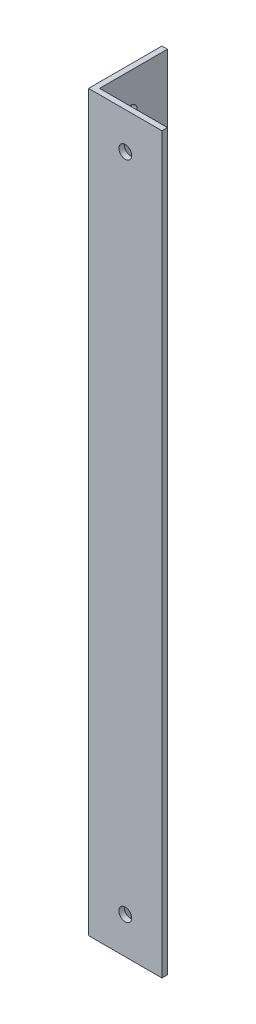
ISO-10303-21;
HEADER;
FILE_DESCRIPTION(('STEP AP214'),'2;1');
FILE_NAME('part.step','',(''),(''),'','','');
FILE_SCHEMA(('AUTOMOTIVE_DESIGN { 1 0 10303 214 1 1 1 1 }'));
ENDSEC;
DATA;
#1=APPLICATION_CONTEXT('core data for automotive mechanical design processes');
#2=APPLICATION_PROTOCOL_DEFINITION('international standard','automotive_design',2000,#1);
#3=PRODUCT_CONTEXT('',#1,'mechanical');
#4=PRODUCT('Part','Part','',(#3));
#5=PRODUCT_RELATED_PRODUCT_CATEGORY('part','',(#4));
#6=PRODUCT_DEFINITION_FORMATION('','',#4);
#7=PRODUCT_DEFINITION_CONTEXT('part definition',#1,'design');
#8=PRODUCT_DEFINITION('design','',#6,#7);
#9=PRODUCT_DEFINITION_SHAPE('','',#8);
#10=(LENGTH_UNIT() NAMED_UNIT(*) SI_UNIT(.MILLI.,.METRE.));
#11=(NAMED_UNIT(*) PLANE_ANGLE_UNIT() SI_UNIT($,.RADIAN.));
#12=(NAMED_UNIT(*) SI_UNIT($,.STERADIAN.) SOLID_ANGLE_UNIT());
#13=UNCERTAINTY_MEASURE_WITH_UNIT(LENGTH_MEASURE(1.E-05),#10,'distance_accuracy_value','');
#14=(GEOMETRIC_REPRESENTATION_CONTEXT(3) GLOBAL_UNCERTAINTY_ASSIGNED_CONTEXT((#13)) GLOBAL_UNIT_ASSIGNED_CONTEXT((#10,
#11,#12)) REPRESENTATION_CONTEXT('',''));
#15=CARTESIAN_POINT('',(0.,0.,0.));
#16=DIRECTION('',(0.,0.,1.));
#17=DIRECTION('',(1.,0.,0.));
#18=AXIS2_PLACEMENT_3D('',#15,#16,#17);
#19=CARTESIAN_POINT('',(0.,200.,-20.));
#20=DIRECTION('',(1.,0.,0.));
#21=DIRECTION('',(0.,0.,-1.));
#22=AXIS2_PLACEMENT_3D('',#19,#20,#21);
#23=PLANE('',#22);
#24=CARTESIAN_POINT('',(0.,10.,-10.));
#25=DIRECTION('',(-1.,0.,0.));
#26=DIRECTION('',(0.,0.,-1.));
#27=AXIS2_PLACEMENT_3D('',#24,#25,#26);
#28=CIRCLE('',#27,1.75);
#29=CARTESIAN_POINT('',(0.,10.,-11.75));
#30=VERTEX_POINT('',#29);
#31=EDGE_CURVE('E164',#30,#30,#28,.T.);
#32=ORIENTED_EDGE('',*,*,#31,.F.);
#33=EDGE_LOOP('',(#32));
#34=FACE_BOUND('',#33,.T.);
#35=CARTESIAN_POINT('',(0.,190.,-10.));
#36=DIRECTION('',(1.,0.,0.));
#37=DIRECTION('',(0.,0.,-1.));
#38=AXIS2_PLACEMENT_3D('',#35,#36,#37);
#39=CIRCLE('',#38,1.75);
#40=CARTESIAN_POINT('',(0.,190.,-11.75));
#41=VERTEX_POINT('',#40);
#42=EDGE_CURVE('E167',#41,#41,#39,.T.);
#43=ORIENTED_EDGE('',*,*,#42,.T.);
#44=EDGE_LOOP('',(#43));
#45=FACE_BOUND('',#44,.T.);
#46=DIRECTION('',(0.,0.,1.));
#47=VECTOR('',#46,1.);
#48=CARTESIAN_POINT('',(0.,0.,-20.));
#49=LINE('',#48,#47);
#50=CARTESIAN_POINT('',(0.,0.,-20.));
#51=VERTEX_POINT('',#50);
#52=CARTESIAN_POINT('',(0.,0.,0.));
#53=VERTEX_POINT('',#52);
#54=EDGE_CURVE('E119',#51,#53,#49,.T.);
#55=ORIENTED_EDGE('',*,*,#54,.T.);
#56=DIRECTION('',(0.,-1.,0.));
#57=VECTOR('',#56,1.);
#58=CARTESIAN_POINT('',(0.,200.,0.));
#59=LINE('',#58,#57);
#60=CARTESIAN_POINT('',(0.,200.,0.));
#61=VERTEX_POINT('',#60);
#62=EDGE_CURVE('E11',#61,#53,#59,.T.);
#63=ORIENTED_EDGE('',*,*,#62,.F.);
#64=DIRECTION('',(0.,0.,1.));
#65=VECTOR('',#64,1.);
#66=CARTESIAN_POINT('',(0.,200.,-20.));
#67=LINE('',#66,#65);
#68=CARTESIAN_POINT('',(0.,200.,-20.));
#69=VERTEX_POINT('',#68);
#70=EDGE_CURVE('E130',#69,#61,#67,.T.);
#71=ORIENTED_EDGE('',*,*,#70,.F.);
#72=DIRECTION('',(0.,-1.,0.));
#73=VECTOR('',#72,1.);
#74=CARTESIAN_POINT('',(0.,200.,-20.));
#75=LINE('',#74,#73);
#76=EDGE_CURVE('E115',#69,#51,#75,.T.);
#77=ORIENTED_EDGE('',*,*,#76,.T.);
#78=EDGE_LOOP('',(#55,#63,#71,#77));
#79=FACE_BOUND('',#78,.T.);
#80=ADVANCED_FACE('F35',(#34,#45,#79),#23,.F.);
#81=CARTESIAN_POINT('',(0.,200.,0.));
#82=DIRECTION('',(0.,0.,-1.));
#83=DIRECTION('',(-1.,0.,0.));
#84=AXIS2_PLACEMENT_3D('',#81,#82,#83);
#85=PLANE('',#84);
#86=CARTESIAN_POINT('',(10.,10.,0.));
#87=DIRECTION('',(0.,0.,-1.));
#88=DIRECTION('',(1.,0.,0.));
#89=AXIS2_PLACEMENT_3D('',#86,#87,#88);
#90=CIRCLE('',#89,1.75);
#91=CARTESIAN_POINT('',(11.75,10.,0.));
#92=VERTEX_POINT('',#91);
#93=EDGE_CURVE('E198',#92,#92,#90,.T.);
#94=ORIENTED_EDGE('',*,*,#93,.T.);
#95=EDGE_LOOP('',(#94));
#96=FACE_BOUND('',#95,.T.);
#97=CARTESIAN_POINT('',(10.,190.,0.));
#98=DIRECTION('',(0.,0.,1.));
#99=DIRECTION('',(1.,0.,0.));
#100=AXIS2_PLACEMENT_3D('',#97,#98,#99);
#101=CIRCLE('',#100,1.75);
#102=CARTESIAN_POINT('',(11.75,190.,0.));
#103=VERTEX_POINT('',#102);
#104=EDGE_CURVE('E169',#103,#103,#101,.T.);
#105=ORIENTED_EDGE('',*,*,#104,.F.);
#106=EDGE_LOOP('',(#105));
#107=FACE_BOUND('',#106,.T.);
#108=DIRECTION('',(1.,0.,0.));
#109=VECTOR('',#108,1.);
#110=CARTESIAN_POINT('',(0.,0.,0.));
#111=LINE('',#110,#109);
#112=CARTESIAN_POINT('',(20.,0.,0.));
#113=VERTEX_POINT('',#112);
#114=EDGE_CURVE('E122',#53,#113,#111,.T.);
#115=ORIENTED_EDGE('',*,*,#114,.T.);
#116=DIRECTION('',(0.,-1.,0.));
#117=VECTOR('',#116,1.);
#118=CARTESIAN_POINT('',(20.,200.,0.));
#119=LINE('',#118,#117);
#120=CARTESIAN_POINT('',(20.,200.,0.));
#121=VERTEX_POINT('',#120);
#122=EDGE_CURVE('E43',#121,#113,#119,.T.);
#123=ORIENTED_EDGE('',*,*,#122,.F.);
#124=DIRECTION('',(1.,0.,0.));
#125=VECTOR('',#124,1.);
#126=CARTESIAN_POINT('',(0.,200.,0.));
#127=LINE('',#126,#125);
#128=EDGE_CURVE('E88',#61,#121,#127,.T.);
#129=ORIENTED_EDGE('',*,*,#128,.F.);
#130=ORIENTED_EDGE('',*,*,#62,.T.);
#131=EDGE_LOOP('',(#115,#123,#129,#130));
#132=FACE_BOUND('',#131,.T.);
#133=ADVANCED_FACE('F155',(#96,#107,#132),#85,.F.);
#134=CARTESIAN_POINT('',(20.,200.,0.));
#135=DIRECTION('',(-1.,0.,0.));
#136=DIRECTION('',(0.,0.,1.));
#137=AXIS2_PLACEMENT_3D('',#134,#135,#136);
#138=PLANE('',#137);
#139=DIRECTION('',(0.,0.,-1.));
#140=VECTOR('',#139,1.);
#141=CARTESIAN_POINT('',(20.,0.,0.));
#142=LINE('',#141,#140);
#143=CARTESIAN_POINT('',(20.,0.,-1.5));
#144=VERTEX_POINT('',#143);
#145=EDGE_CURVE('E125',#113,#144,#142,.T.);
#146=ORIENTED_EDGE('',*,*,#145,.T.);
#147=DIRECTION('',(0.,-1.,0.));
#148=VECTOR('',#147,1.);
#149=CARTESIAN_POINT('',(20.,200.,-1.5));
#150=LINE('',#149,#148);
#151=CARTESIAN_POINT('',(20.,200.,-1.5));
#152=VERTEX_POINT('',#151);
#153=EDGE_CURVE('E110',#152,#144,#150,.T.);
#154=ORIENTED_EDGE('',*,*,#153,.F.);
#155=DIRECTION('',(0.,0.,-1.));
#156=VECTOR('',#155,1.);
#157=CARTESIAN_POINT('',(20.,200.,0.));
#158=LINE('',#157,#156);
#159=EDGE_CURVE('E101',#121,#152,#158,.T.);
#160=ORIENTED_EDGE('',*,*,#159,.F.);
#161=ORIENTED_EDGE('',*,*,#122,.T.);
#162=EDGE_LOOP('',(#146,#154,#160,#161));
#163=FACE_BOUND('',#162,.T.);
#164=ADVANCED_FACE('F136',(#163),#138,.F.);
#165=CARTESIAN_POINT('',(20.,200.,-1.5));
#166=DIRECTION('',(0.,0.,1.));
#167=DIRECTION('',(1.,0.,0.));
#168=AXIS2_PLACEMENT_3D('',#165,#166,#167);
#169=PLANE('',#168);
#170=CARTESIAN_POINT('',(10.,10.,-1.5));
#171=DIRECTION('',(0.,0.,1.));
#172=DIRECTION('',(1.,0.,0.));
#173=AXIS2_PLACEMENT_3D('',#170,#171,#172);
#174=CIRCLE('',#173,1.75);
#175=CARTESIAN_POINT('',(11.75,10.,-1.5));
#176=VERTEX_POINT('',#175);
#177=EDGE_CURVE('E196',#176,#176,#174,.T.);
#178=ORIENTED_EDGE('',*,*,#177,.T.);
#179=EDGE_LOOP('',(#178));
#180=FACE_BOUND('',#179,.T.);
#181=CARTESIAN_POINT('',(10.,190.,-1.5));
#182=DIRECTION('',(0.,0.,1.));
#183=DIRECTION('',(1.,0.,0.));
#184=AXIS2_PLACEMENT_3D('',#181,#182,#183);
#185=CIRCLE('',#184,1.75);
#186=CARTESIAN_POINT('',(11.75,190.,-1.5));
#187=VERTEX_POINT('',#186);
#188=EDGE_CURVE('E123',#187,#187,#185,.F.);
#189=ORIENTED_EDGE('',*,*,#188,.F.);
#190=EDGE_LOOP('',(#189));
#191=FACE_BOUND('',#190,.T.);
#192=DIRECTION('',(-1.,0.,0.));
#193=VECTOR('',#192,1.);
#194=CARTESIAN_POINT('',(20.,0.,-1.5));
#195=LINE('',#194,#193);
#196=CARTESIAN_POINT('',(1.5,0.,-1.5));
#197=VERTEX_POINT('',#196);
#198=EDGE_CURVE('E109',#144,#197,#195,.T.);
#199=ORIENTED_EDGE('',*,*,#198,.T.);
#200=DIRECTION('',(0.,-1.,0.));
#201=VECTOR('',#200,1.);
#202=CARTESIAN_POINT('',(1.5,200.,-1.5));
#203=LINE('',#202,#201);
#204=CARTESIAN_POINT('',(1.5,200.,-1.5));
#205=VERTEX_POINT('',#204);
#206=EDGE_CURVE('E106',#205,#197,#203,.T.);
#207=ORIENTED_EDGE('',*,*,#206,.F.);
#208=DIRECTION('',(-1.,0.,0.));
#209=VECTOR('',#208,1.);
#210=CARTESIAN_POINT('',(20.,200.,-1.5));
#211=LINE('',#210,#209);
#212=EDGE_CURVE('E95',#152,#205,#211,.T.);
#213=ORIENTED_EDGE('',*,*,#212,.F.);
#214=ORIENTED_EDGE('',*,*,#153,.T.);
#215=EDGE_LOOP('',(#199,#207,#213,#214));
#216=FACE_BOUND('',#215,.T.);
#217=ADVANCED_FACE('F107',(#180,#191,#216),#169,.F.);
#218=CARTESIAN_POINT('',(1.5,200.,-1.5));
#219=DIRECTION('',(-1.,0.,0.));
#220=DIRECTION('',(0.,0.,1.));
#221=AXIS2_PLACEMENT_3D('',#218,#219,#220);
#222=PLANE('',#221);
#223=CARTESIAN_POINT('',(1.5,10.,-10.));
#224=DIRECTION('',(-1.,0.,0.));
#225=DIRECTION('',(0.,0.,1.));
#226=AXIS2_PLACEMENT_3D('',#223,#224,#225);
#227=CIRCLE('',#226,1.75);
#228=CARTESIAN_POINT('',(1.5,10.,-8.25));
#229=VERTEX_POINT('',#228);
#230=EDGE_CURVE('E175',#229,#229,#227,.F.);
#231=ORIENTED_EDGE('',*,*,#230,.F.);
#232=EDGE_LOOP('',(#231));
#233=FACE_BOUND('',#232,.T.);
#234=CARTESIAN_POINT('',(1.5,190.,-10.));
#235=DIRECTION('',(-1.,0.,0.));
#236=DIRECTION('',(0.,0.,1.));
#237=AXIS2_PLACEMENT_3D('',#234,#235,#236);
#238=CIRCLE('',#237,1.75);
#239=CARTESIAN_POINT('',(1.5,190.,-8.25));
#240=VERTEX_POINT('',#239);
#241=EDGE_CURVE('E170',#240,#240,#238,.T.);
#242=ORIENTED_EDGE('',*,*,#241,.T.);
#243=EDGE_LOOP('',(#242));
#244=FACE_BOUND('',#243,.T.);
#245=DIRECTION('',(0.,0.,-1.));
#246=VECTOR('',#245,1.);
#247=CARTESIAN_POINT('',(1.5,0.,-1.5));
#248=LINE('',#247,#246);
#249=CARTESIAN_POINT('',(1.5,0.,-20.));
#250=VERTEX_POINT('',#249);
#251=EDGE_CURVE('E74',#197,#250,#248,.T.);
#252=ORIENTED_EDGE('',*,*,#251,.T.);
#253=DIRECTION('',(0.,-1.,0.));
#254=VECTOR('',#253,1.);
#255=CARTESIAN_POINT('',(1.5,200.,-20.));
#256=LINE('',#255,#254);
#257=CARTESIAN_POINT('',(1.5,200.,-20.));
#258=VERTEX_POINT('',#257);
#259=EDGE_CURVE('E111',#258,#250,#256,.T.);
#260=ORIENTED_EDGE('',*,*,#259,.F.);
#261=DIRECTION('',(0.,0.,-1.));
#262=VECTOR('',#261,1.);
#263=CARTESIAN_POINT('',(1.5,200.,-1.5));
#264=LINE('',#263,#262);
#265=EDGE_CURVE('E99',#205,#258,#264,.T.);
#266=ORIENTED_EDGE('',*,*,#265,.F.);
#267=ORIENTED_EDGE('',*,*,#206,.T.);
#268=EDGE_LOOP('',(#252,#260,#266,#267));
#269=FACE_BOUND('',#268,.T.);
#270=ADVANCED_FACE('F113',(#233,#244,#269),#222,.F.);
#271=CARTESIAN_POINT('',(1.5,200.,-20.));
#272=DIRECTION('',(0.,0.,1.));
#273=DIRECTION('',(1.,0.,0.));
#274=AXIS2_PLACEMENT_3D('',#271,#272,#273);
#275=PLANE('',#274);
#276=DIRECTION('',(-1.,0.,0.));
#277=VECTOR('',#276,1.);
#278=CARTESIAN_POINT('',(1.5,0.,-20.));
#279=LINE('',#278,#277);
#280=EDGE_CURVE('E80',#250,#51,#279,.T.);
#281=ORIENTED_EDGE('',*,*,#280,.T.);
#282=ORIENTED_EDGE('',*,*,#76,.F.);
#283=DIRECTION('',(-1.,0.,0.));
#284=VECTOR('',#283,1.);
#285=CARTESIAN_POINT('',(1.5,200.,-20.));
#286=LINE('',#285,#284);
#287=EDGE_CURVE('E51',#258,#69,#286,.T.);
#288=ORIENTED_EDGE('',*,*,#287,.F.);
#289=ORIENTED_EDGE('',*,*,#259,.T.);
#290=EDGE_LOOP('',(#281,#282,#288,#289));
#291=FACE_BOUND('',#290,.T.);
#292=ADVANCED_FACE('F143',(#291),#275,.F.);
#293=CARTESIAN_POINT('',(0.,200.,0.));
#294=DIRECTION('',(0.,1.,0.));
#295=DIRECTION('',(0.,0.,1.));
#296=AXIS2_PLACEMENT_3D('',#293,#294,#295);
#297=PLANE('',#296);
#298=ORIENTED_EDGE('',*,*,#70,.T.);
#299=ORIENTED_EDGE('',*,*,#128,.T.);
#300=ORIENTED_EDGE('',*,*,#159,.T.);
#301=ORIENTED_EDGE('',*,*,#212,.T.);
#302=ORIENTED_EDGE('',*,*,#265,.T.);
#303=ORIENTED_EDGE('',*,*,#287,.T.);
#304=EDGE_LOOP('',(#298,#299,#300,#301,#302,#303));
#305=FACE_BOUND('',#304,.T.);
#306=ADVANCED_FACE('F97',(#305),#297,.T.);
#307=CARTESIAN_POINT('',(0.,0.,0.));
#308=DIRECTION('',(0.,1.,0.));
#309=DIRECTION('',(0.,0.,1.));
#310=AXIS2_PLACEMENT_3D('',#307,#308,#309);
#311=PLANE('',#310);
#312=ORIENTED_EDGE('',*,*,#54,.F.);
#313=ORIENTED_EDGE('',*,*,#280,.F.);
#314=ORIENTED_EDGE('',*,*,#251,.F.);
#315=ORIENTED_EDGE('',*,*,#198,.F.);
#316=ORIENTED_EDGE('',*,*,#145,.F.);
#317=ORIENTED_EDGE('',*,*,#114,.F.);
#318=EDGE_LOOP('',(#312,#313,#314,#315,#316,#317));
#319=FACE_BOUND('',#318,.T.);
#320=ADVANCED_FACE('F139',(#319),#311,.F.);
#321=CARTESIAN_POINT('',(10.,190.,-20.001));
#322=DIRECTION('',(0.,0.,1.));
#323=DIRECTION('',(1.,0.,0.));
#324=AXIS2_PLACEMENT_3D('',#321,#322,#323);
#325=CYLINDRICAL_SURFACE('',#324,1.75);
#326=ORIENTED_EDGE('',*,*,#104,.T.);
#327=EDGE_LOOP('',(#326));
#328=FACE_BOUND('',#327,.T.);
#329=ORIENTED_EDGE('',*,*,#188,.T.);
#330=EDGE_LOOP('',(#329));
#331=FACE_BOUND('',#330,.T.);
#332=ADVANCED_FACE('F185',(#328,#331),#325,.F.);
#333=CARTESIAN_POINT('',(20.001,190.,-9.99999999999996));
#334=DIRECTION('',(-1.,0.,0.));
#335=DIRECTION('',(0.,0.,1.));
#336=AXIS2_PLACEMENT_3D('',#333,#334,#335);
#337=CYLINDRICAL_SURFACE('',#336,1.75);
#338=ORIENTED_EDGE('',*,*,#42,.F.);
#339=EDGE_LOOP('',(#338));
#340=FACE_BOUND('',#339,.T.);
#341=ORIENTED_EDGE('',*,*,#241,.F.);
#342=EDGE_LOOP('',(#341));
#343=FACE_BOUND('',#342,.T.);
#344=ADVANCED_FACE('F210',(#340,#343),#337,.F.);
#345=CARTESIAN_POINT('',(20.001,10.,-9.99999999999996));
#346=DIRECTION('',(-1.,0.,0.));
#347=DIRECTION('',(0.,0.,1.));
#348=AXIS2_PLACEMENT_3D('',#345,#346,#347);
#349=CYLINDRICAL_SURFACE('',#348,1.75);
#350=ORIENTED_EDGE('',*,*,#31,.T.);
#351=EDGE_LOOP('',(#350));
#352=FACE_BOUND('',#351,.T.);
#353=ORIENTED_EDGE('',*,*,#230,.T.);
#354=EDGE_LOOP('',(#353));
#355=FACE_BOUND('',#354,.T.);
#356=ADVANCED_FACE('F206',(#352,#355),#349,.F.);
#357=CARTESIAN_POINT('',(10.,10.,-20.001));
#358=DIRECTION('',(0.,0.,1.));
#359=DIRECTION('',(1.,0.,0.));
#360=AXIS2_PLACEMENT_3D('',#357,#358,#359);
#361=CYLINDRICAL_SURFACE('',#360,1.75);
#362=ORIENTED_EDGE('',*,*,#93,.F.);
#363=EDGE_LOOP('',(#362));
#364=FACE_BOUND('',#363,.T.);
#365=ORIENTED_EDGE('',*,*,#177,.F.);
#366=EDGE_LOOP('',(#365));
#367=FACE_BOUND('',#366,.T.);
#368=ADVANCED_FACE('F217',(#364,#367),#361,.F.);
#369=CLOSED_SHELL('',(#80,#133,#164,#217,#270,#292,#306,#320,#332,#344,#356,#368));
#370=MANIFOLD_SOLID_BREP('B2',#369);
#371=ADVANCED_BREP_SHAPE_REPRESENTATION('',(#18,#370),#14);
#372=SHAPE_DEFINITION_REPRESENTATION(#9,#371);
ENDSEC;
END-ISO-10303-21;
